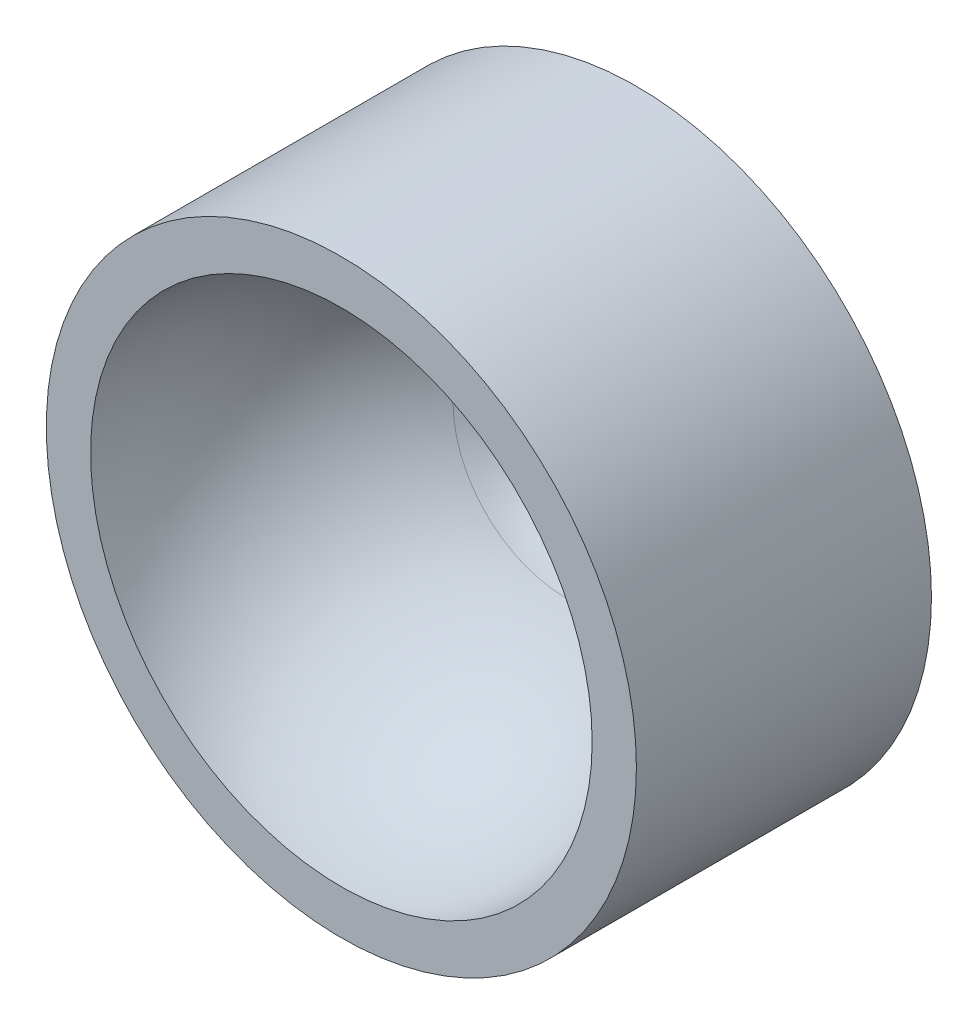
ISO-10303-21;
HEADER;
FILE_DESCRIPTION(('STEP AP214'),'2;1');
FILE_NAME('part.step','',(''),(''),'','','');
FILE_SCHEMA(('AUTOMOTIVE_DESIGN { 1 0 10303 214 1 1 1 1 }'));
ENDSEC;
DATA;
#1=APPLICATION_CONTEXT('core data for automotive mechanical design processes');
#2=APPLICATION_PROTOCOL_DEFINITION('international standard','automotive_design',2000,#1);
#3=PRODUCT_CONTEXT('',#1,'mechanical');
#4=PRODUCT('Part','Part','',(#3));
#5=PRODUCT_RELATED_PRODUCT_CATEGORY('part','',(#4));
#6=PRODUCT_DEFINITION_FORMATION('','',#4);
#7=PRODUCT_DEFINITION_CONTEXT('part definition',#1,'design');
#8=PRODUCT_DEFINITION('design','',#6,#7);
#9=PRODUCT_DEFINITION_SHAPE('','',#8);
#10=(LENGTH_UNIT() NAMED_UNIT(*) SI_UNIT(.MILLI.,.METRE.));
#11=(NAMED_UNIT(*) PLANE_ANGLE_UNIT() SI_UNIT($,.RADIAN.));
#12=(NAMED_UNIT(*) SI_UNIT($,.STERADIAN.) SOLID_ANGLE_UNIT());
#13=UNCERTAINTY_MEASURE_WITH_UNIT(LENGTH_MEASURE(1.E-05),#10,'distance_accuracy_value','');
#14=(GEOMETRIC_REPRESENTATION_CONTEXT(3) GLOBAL_UNCERTAINTY_ASSIGNED_CONTEXT((#13)) GLOBAL_UNIT_ASSIGNED_CONTEXT((#10,
#11,#12)) REPRESENTATION_CONTEXT('',''));
#15=CARTESIAN_POINT('',(0.,0.,0.));
#16=DIRECTION('',(0.,0.,1.));
#17=DIRECTION('',(1.,0.,0.));
#18=AXIS2_PLACEMENT_3D('',#15,#16,#17);
#19=CARTESIAN_POINT('',(0.,0.,10.));
#20=DIRECTION('',(0.,0.,1.));
#21=DIRECTION('',(1.,0.,0.));
#22=AXIS2_PLACEMENT_3D('',#19,#20,#21);
#23=PLANE('',#22);
#24=CARTESIAN_POINT('',(0.,0.,10.));
#25=DIRECTION('',(0.,0.,1.));
#26=DIRECTION('',(1.,0.,0.));
#27=AXIS2_PLACEMENT_3D('',#24,#25,#26);
#28=CIRCLE('',#27,10.);
#29=CARTESIAN_POINT('',(10.,0.,10.));
#30=VERTEX_POINT('',#29);
#31=EDGE_CURVE('E38',#30,#30,#28,.T.);
#32=ORIENTED_EDGE('',*,*,#31,.T.);
#33=EDGE_LOOP('',(#32));
#34=FACE_BOUND('',#33,.T.);
#35=CARTESIAN_POINT('',(0.,0.,10.));
#36=DIRECTION('',(0.,0.,1.));
#37=DIRECTION('',(1.,0.,0.));
#38=AXIS2_PLACEMENT_3D('',#35,#36,#37);
#39=CIRCLE('',#38,8.5);
#40=CARTESIAN_POINT('',(8.5,0.,10.));
#41=VERTEX_POINT('',#40);
#42=EDGE_CURVE('E47',#41,#41,#39,.F.);
#43=ORIENTED_EDGE('',*,*,#42,.T.);
#44=EDGE_LOOP('',(#43));
#45=FACE_BOUND('',#44,.T.);
#46=ADVANCED_FACE('F31',(#34,#45),#23,.T.);
#47=CARTESIAN_POINT('',(0.,0.,10.));
#48=DIRECTION('',(0.,0.,-1.));
#49=DIRECTION('',(-1.,0.,0.));
#50=AXIS2_PLACEMENT_3D('',#47,#48,#49);
#51=CYLINDRICAL_SURFACE('',#50,10.);
#52=ORIENTED_EDGE('',*,*,#31,.F.);
#53=EDGE_LOOP('',(#52));
#54=FACE_BOUND('',#53,.T.);
#55=CARTESIAN_POINT('',(0.,0.,0.));
#56=DIRECTION('',(0.,0.,1.));
#57=DIRECTION('',(1.,0.,0.));
#58=AXIS2_PLACEMENT_3D('',#55,#56,#57);
#59=CIRCLE('',#58,10.);
#60=CARTESIAN_POINT('',(10.,0.,0.));
#61=VERTEX_POINT('',#60);
#62=EDGE_CURVE('E42',#61,#61,#59,.T.);
#63=ORIENTED_EDGE('',*,*,#62,.T.);
#64=EDGE_LOOP('',(#63));
#65=FACE_BOUND('',#64,.T.);
#66=ADVANCED_FACE('F62',(#54,#65),#51,.T.);
#67=CARTESIAN_POINT('',(0.,0.,0.));
#68=DIRECTION('',(0.,0.,1.));
#69=DIRECTION('',(1.,0.,0.));
#70=AXIS2_PLACEMENT_3D('',#67,#68,#69);
#71=PLANE('',#70);
#72=CARTESIAN_POINT('',(0.,0.,0.));
#73=DIRECTION('',(0.,0.,-1.));
#74=DIRECTION('',(-1.,0.,0.));
#75=AXIS2_PLACEMENT_3D('',#72,#73,#74);
#76=CIRCLE('',#75,1.5);
#77=CARTESIAN_POINT('',(-1.5,0.,0.));
#78=VERTEX_POINT('',#77);
#79=EDGE_CURVE('E50',#78,#78,#76,.T.);
#80=ORIENTED_EDGE('',*,*,#79,.F.);
#81=EDGE_LOOP('',(#80));
#82=FACE_BOUND('',#81,.T.);
#83=ORIENTED_EDGE('',*,*,#62,.F.);
#84=EDGE_LOOP('',(#83));
#85=FACE_BOUND('',#84,.T.);
#86=ADVANCED_FACE('F58',(#82,#85),#71,.F.);
#87=CARTESIAN_POINT('',(0.,0.,10.));
#88=DIRECTION('',(0.,1.,0.));
#89=DIRECTION('',(1.,0.,0.));
#90=AXIS2_PLACEMENT_3D('',#87,#88,#89);
#91=SPHERICAL_SURFACE('',#90,8.5);
#92=CARTESIAN_POINT('',(0.,0.,10.));
#93=DIRECTION('',(0.,0.,1.));
#94=DIRECTION('',(1.,0.,0.));
#95=AXIS2_PLACEMENT_3D('',#92,#93,#94);
#96=SPHERICAL_SURFACE('',#95,8.5);
#97=CARTESIAN_POINT('',(0.,0.,2.40219990046741));
#98=DIRECTION('',(0.,0.,1.));
#99=DIRECTION('',(1.,0.,0.));
#100=AXIS2_PLACEMENT_3D('',#97,#98,#99);
#101=CIRCLE('',#100,3.8109622994124);
#102=CARTESIAN_POINT('',(3.8109622994124,0.,2.40219990046741));
#103=VERTEX_POINT('',#102);
#104=EDGE_CURVE('E10',#103,#103,#101,.F.);
#105=ORIENTED_EDGE('',*,*,#104,.T.);
#106=EDGE_LOOP('',(#105));
#107=FACE_BOUND('',#106,.T.);
#108=ORIENTED_EDGE('',*,*,#42,.F.);
#109=EDGE_LOOP('',(#108));
#110=FACE_BOUND('',#109,.T.);
#111=ADVANCED_FACE('F61',(#107,#110),#96,.F.);
#112=CARTESIAN_POINT('',(0.,0.,-2.06709427572822));
#113=DIRECTION('',(0.,0.,1.));
#114=DIRECTION('',(1.,0.,0.));
#115=AXIS2_PLACEMENT_3D('',#112,#113,#114);
#116=TOROIDAL_SURFACE('',#115,6.05270482847852,5.);
#117=ORIENTED_EDGE('',*,*,#104,.F.);
#118=EDGE_LOOP('',(#117));
#119=FACE_BOUND('',#118,.T.);
#120=ORIENTED_EDGE('',*,*,#79,.T.);
#121=EDGE_LOOP('',(#120));
#122=FACE_BOUND('',#121,.T.);
#123=ADVANCED_FACE('F33',(#119,#122),#116,.T.);
#124=CLOSED_SHELL('',(#46,#66,#86,#111,#123));
#125=MANIFOLD_SOLID_BREP('B2',#124);
#126=ADVANCED_BREP_SHAPE_REPRESENTATION('',(#18,#125),#14);
#127=SHAPE_DEFINITION_REPRESENTATION(#9,#126);
ENDSEC;
END-ISO-10303-21;
